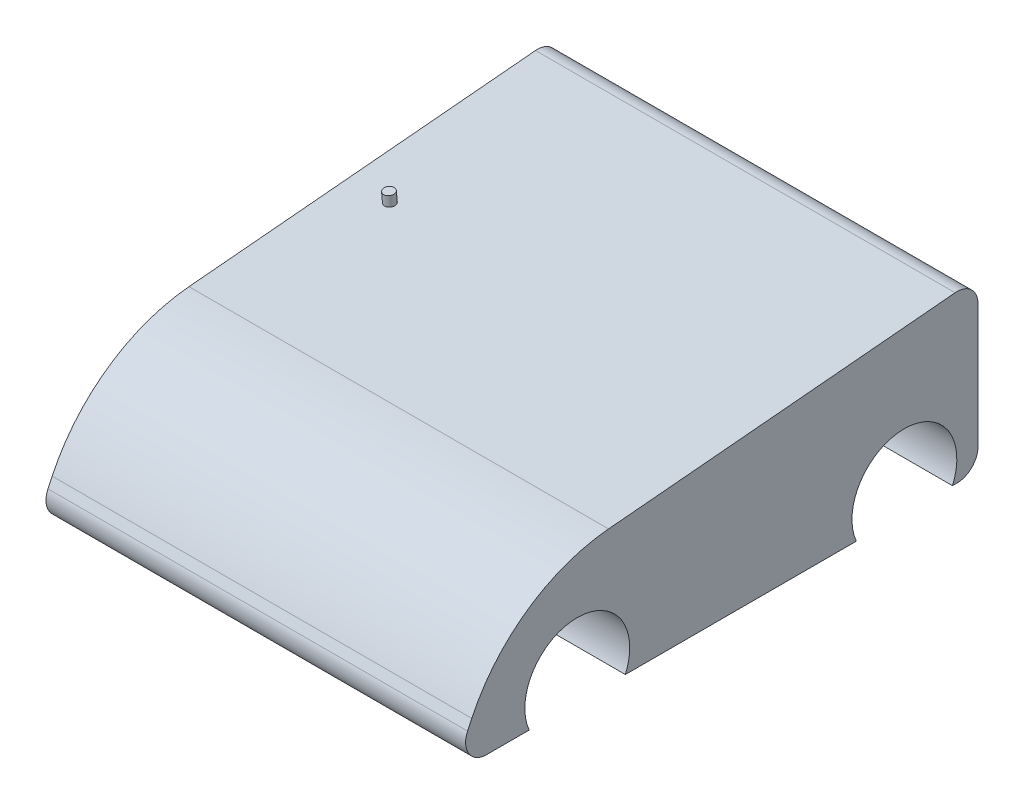
ISO-10303-21;
HEADER;
FILE_DESCRIPTION(('STEP AP214'),'2;1');
FILE_NAME('part.step','',(''),(''),'','','');
FILE_SCHEMA(('AUTOMOTIVE_DESIGN { 1 0 10303 214 1 1 1 1 }'));
ENDSEC;
DATA;
#1=APPLICATION_CONTEXT('core data for automotive mechanical design processes');
#2=APPLICATION_PROTOCOL_DEFINITION('international standard','automotive_design',2000,#1);
#3=PRODUCT_CONTEXT('',#1,'mechanical');
#4=PRODUCT('Part','Part','',(#3));
#5=PRODUCT_RELATED_PRODUCT_CATEGORY('part','',(#4));
#6=PRODUCT_DEFINITION_FORMATION('','',#4);
#7=PRODUCT_DEFINITION_CONTEXT('part definition',#1,'design');
#8=PRODUCT_DEFINITION('design','',#6,#7);
#9=PRODUCT_DEFINITION_SHAPE('','',#8);
#10=(LENGTH_UNIT() NAMED_UNIT(*) SI_UNIT(.MILLI.,.METRE.));
#11=(NAMED_UNIT(*) PLANE_ANGLE_UNIT() SI_UNIT($,.RADIAN.));
#12=(NAMED_UNIT(*) SI_UNIT($,.STERADIAN.) SOLID_ANGLE_UNIT());
#13=UNCERTAINTY_MEASURE_WITH_UNIT(LENGTH_MEASURE(1.E-05),#10,'distance_accuracy_value','');
#14=(GEOMETRIC_REPRESENTATION_CONTEXT(3) GLOBAL_UNCERTAINTY_ASSIGNED_CONTEXT((#13)) GLOBAL_UNIT_ASSIGNED_CONTEXT((#10,
#11,#12)) REPRESENTATION_CONTEXT('',''));
#15=CARTESIAN_POINT('',(0.,0.,0.));
#16=DIRECTION('',(0.,0.,1.));
#17=DIRECTION('',(1.,0.,0.));
#18=AXIS2_PLACEMENT_3D('',#15,#16,#17);
#19=CARTESIAN_POINT('',(100.,0.,-120.64681724846));
#20=DIRECTION('',(0.,1.,0.));
#21=DIRECTION('',(0.,0.,1.));
#22=AXIS2_PLACEMENT_3D('',#19,#20,#21);
#23=PLANE('',#22);
#24=DIRECTION('',(-1.,0.,0.));
#25=VECTOR('',#24,1.);
#26=CARTESIAN_POINT('',(-50.,0.,-118.474582971866));
#27=LINE('',#26,#25);
#28=CARTESIAN_POINT('',(-100.,0.,-118.474582971866));
#29=VERTEX_POINT('',#28);
#30=CARTESIAN_POINT('',(-50.,0.,-118.474582971866));
#31=VERTEX_POINT('',#30);
#32=EDGE_CURVE('E156',#29,#31,#27,.F.);
#33=ORIENTED_EDGE('',*,*,#32,.F.);
#34=DIRECTION('',(0.,0.,-1.));
#35=VECTOR('',#34,1.);
#36=CARTESIAN_POINT('',(-100.,0.,-120.64681724846));
#37=LINE('',#36,#35);
#38=CARTESIAN_POINT('',(-100.,0.,-120.64681724846));
#39=VERTEX_POINT('',#38);
#40=EDGE_CURVE('E219',#29,#39,#37,.T.);
#41=ORIENTED_EDGE('',*,*,#40,.T.);
#42=DIRECTION('',(-1.,0.,0.));
#43=VECTOR('',#42,1.);
#44=CARTESIAN_POINT('',(100.,0.,-120.64681724846));
#45=LINE('',#44,#43);
#46=CARTESIAN_POINT('',(100.,0.,-120.64681724846));
#47=VERTEX_POINT('',#46);
#48=EDGE_CURVE('E241',#47,#39,#45,.T.);
#49=ORIENTED_EDGE('',*,*,#48,.F.);
#50=DIRECTION('',(0.,0.,-1.));
#51=VECTOR('',#50,1.);
#52=CARTESIAN_POINT('',(100.,0.,-120.64681724846));
#53=LINE('',#52,#51);
#54=CARTESIAN_POINT('',(100.,0.,-118.474582971866));
#55=VERTEX_POINT('',#54);
#56=EDGE_CURVE('E199',#55,#47,#53,.T.);
#57=ORIENTED_EDGE('',*,*,#56,.F.);
#58=DIRECTION('',(1.,0.,0.));
#59=VECTOR('',#58,1.);
#60=CARTESIAN_POINT('',(50.,0.,-118.474582971866));
#61=LINE('',#60,#59);
#62=CARTESIAN_POINT('',(50.,0.,-118.474582971866));
#63=VERTEX_POINT('',#62);
#64=EDGE_CURVE('E175',#55,#63,#61,.F.);
#65=ORIENTED_EDGE('',*,*,#64,.T.);
#66=DIRECTION('',(0.,0.,-1.));
#67=VECTOR('',#66,1.);
#68=CARTESIAN_POINT('',(50.,0.,-120.64681724846));
#69=LINE('',#68,#67);
#70=CARTESIAN_POINT('',(50.,0.,-72.6488260223073));
#71=VERTEX_POINT('',#70);
#72=EDGE_CURVE('E261',#71,#63,#69,.T.);
#73=ORIENTED_EDGE('',*,*,#72,.F.);
#74=DIRECTION('',(1.,0.,0.));
#75=VECTOR('',#74,1.);
#76=CARTESIAN_POINT('',(50.,0.,-72.6488260223073));
#77=LINE('',#76,#75);
#78=CARTESIAN_POINT('',(100.,0.,-72.6488260223073));
#79=VERTEX_POINT('',#78);
#80=EDGE_CURVE('E178',#71,#79,#77,.T.);
#81=ORIENTED_EDGE('',*,*,#80,.T.);
#82=CARTESIAN_POINT('',(100.,0.,37.4446152953902));
#83=VERTEX_POINT('',#82);
#84=EDGE_CURVE('E204',#83,#79,#53,.T.);
#85=ORIENTED_EDGE('',*,*,#84,.F.);
#86=DIRECTION('',(1.,0.,0.));
#87=VECTOR('',#86,1.);
#88=CARTESIAN_POINT('',(50.,0.,37.4446152953902));
#89=LINE('',#88,#87);
#90=CARTESIAN_POINT('',(50.,0.,37.4446152953902));
#91=VERTEX_POINT('',#90);
#92=EDGE_CURVE('E184',#83,#91,#89,.F.);
#93=ORIENTED_EDGE('',*,*,#92,.T.);
#94=DIRECTION('',(0.,0.,-1.));
#95=VECTOR('',#94,1.);
#96=CARTESIAN_POINT('',(50.,0.,-120.64681724846));
#97=LINE('',#96,#95);
#98=CARTESIAN_POINT('',(50.,0.,83.2703722449486));
#99=VERTEX_POINT('',#98);
#100=EDGE_CURVE('E256',#99,#91,#97,.T.);
#101=ORIENTED_EDGE('',*,*,#100,.F.);
#102=DIRECTION('',(1.,0.,0.));
#103=VECTOR('',#102,1.);
#104=CARTESIAN_POINT('',(50.,0.,83.2703722449486));
#105=LINE('',#104,#103);
#106=CARTESIAN_POINT('',(100.,0.,83.2703722449486));
#107=VERTEX_POINT('',#106);
#108=EDGE_CURVE('E187',#99,#107,#105,.T.);
#109=ORIENTED_EDGE('',*,*,#108,.T.);
#110=CARTESIAN_POINT('',(100.,0.,103.595649646737));
#111=VERTEX_POINT('',#110);
#112=EDGE_CURVE('E200',#111,#107,#53,.T.);
#113=ORIENTED_EDGE('',*,*,#112,.F.);
#114=DIRECTION('',(-1.,0.,0.));
#115=VECTOR('',#114,1.);
#116=CARTESIAN_POINT('',(100.,0.,103.595649646737));
#117=LINE('',#116,#115);
#118=CARTESIAN_POINT('',(-100.,0.,103.595649646737));
#119=VERTEX_POINT('',#118);
#120=EDGE_CURVE('E244',#111,#119,#117,.T.);
#121=ORIENTED_EDGE('',*,*,#120,.T.);
#122=CARTESIAN_POINT('',(-100.,0.,83.2703722449486));
#123=VERTEX_POINT('',#122);
#124=EDGE_CURVE('E220',#119,#123,#37,.T.);
#125=ORIENTED_EDGE('',*,*,#124,.T.);
#126=DIRECTION('',(-1.,0.,0.));
#127=VECTOR('',#126,1.);
#128=CARTESIAN_POINT('',(-50.,0.,83.2703722449486));
#129=LINE('',#128,#127);
#130=CARTESIAN_POINT('',(-50.,0.,83.2703722449486));
#131=VERTEX_POINT('',#130);
#132=EDGE_CURVE('E58',#131,#123,#129,.T.);
#133=ORIENTED_EDGE('',*,*,#132,.F.);
#134=DIRECTION('',(0.,0.,1.));
#135=VECTOR('',#134,1.);
#136=CARTESIAN_POINT('',(-50.,0.,-120.64681724846));
#137=LINE('',#136,#135);
#138=CARTESIAN_POINT('',(-50.,0.,37.4446152953902));
#139=VERTEX_POINT('',#138);
#140=EDGE_CURVE('E265',#139,#131,#137,.T.);
#141=ORIENTED_EDGE('',*,*,#140,.F.);
#142=DIRECTION('',(-1.,0.,0.));
#143=VECTOR('',#142,1.);
#144=CARTESIAN_POINT('',(-50.,0.,37.4446152953902));
#145=LINE('',#144,#143);
#146=CARTESIAN_POINT('',(-100.,0.,37.4446152953902));
#147=VERTEX_POINT('',#146);
#148=EDGE_CURVE('E170',#147,#139,#145,.F.);
#149=ORIENTED_EDGE('',*,*,#148,.F.);
#150=CARTESIAN_POINT('',(-100.,0.,-72.6488260223073));
#151=VERTEX_POINT('',#150);
#152=EDGE_CURVE('E162',#147,#151,#37,.T.);
#153=ORIENTED_EDGE('',*,*,#152,.T.);
#154=DIRECTION('',(-1.,0.,0.));
#155=VECTOR('',#154,1.);
#156=CARTESIAN_POINT('',(-50.,0.,-72.6488260223073));
#157=LINE('',#156,#155);
#158=CARTESIAN_POINT('',(-50.,0.,-72.6488260223073));
#159=VERTEX_POINT('',#158);
#160=EDGE_CURVE('E50',#159,#151,#157,.T.);
#161=ORIENTED_EDGE('',*,*,#160,.F.);
#162=DIRECTION('',(0.,0.,1.));
#163=VECTOR('',#162,1.);
#164=CARTESIAN_POINT('',(-50.,0.,-120.64681724846));
#165=LINE('',#164,#163);
#166=EDGE_CURVE('E43',#31,#159,#165,.T.);
#167=ORIENTED_EDGE('',*,*,#166,.F.);
#168=EDGE_LOOP('',(#33,#41,#49,#57,#65,#73,#81,#85,#93,#101,#109,#113,#121,#125,#133,#141,#149,
#153,#161,#167));
#169=FACE_BOUND('',#168,.T.);
#170=ADVANCED_FACE('F35',(#169),#23,.F.);
#171=CARTESIAN_POINT('',(100.,-15.5574989256104,38.2592290091834));
#172=DIRECTION('',(-1.,0.,0.));
#173=DIRECTION('',(0.,0.,1.));
#174=AXIS2_PLACEMENT_3D('',#171,#172,#173);
#175=CYLINDRICAL_SURFACE('',#174,80.);
#176=CARTESIAN_POINT('',(-100.,-15.5574989256104,38.2592290091834));
#177=DIRECTION('',(1.,0.,0.));
#178=DIRECTION('',(0.,0.,1.));
#179=AXIS2_PLACEMENT_3D('',#176,#177,#178);
#180=CIRCLE('',#179,80.);
#181=CARTESIAN_POINT('',(-100.,64.1191375635172,45.4448812258877));
#182=VERTEX_POINT('',#181);
#183=CARTESIAN_POINT('',(-100.,18.5050709528454,110.645286598165));
#184=VERTEX_POINT('',#183);
#185=EDGE_CURVE('E190',#182,#184,#180,.T.);
#186=ORIENTED_EDGE('',*,*,#185,.T.);
#187=DIRECTION('',(-1.,0.,0.));
#188=VECTOR('',#187,1.);
#189=CARTESIAN_POINT('',(100.,18.5050709528454,110.645286598165));
#190=LINE('',#189,#188);
#191=CARTESIAN_POINT('',(100.,18.5050709528454,110.645286598165));
#192=VERTEX_POINT('',#191);
#193=EDGE_CURVE('E250',#192,#184,#190,.T.);
#194=ORIENTED_EDGE('',*,*,#193,.F.);
#195=CARTESIAN_POINT('',(100.,-15.5574989256104,38.2592290091834));
#196=DIRECTION('',(1.,0.,0.));
#197=DIRECTION('',(0.,0.,1.));
#198=AXIS2_PLACEMENT_3D('',#195,#196,#197);
#199=CIRCLE('',#198,80.);
#200=CARTESIAN_POINT('',(100.,64.1191375635172,45.4448812258877));
#201=VERTEX_POINT('',#200);
#202=EDGE_CURVE('E191',#201,#192,#199,.T.);
#203=ORIENTED_EDGE('',*,*,#202,.F.);
#204=DIRECTION('',(-1.,0.,0.));
#205=VECTOR('',#204,1.);
#206=CARTESIAN_POINT('',(100.,64.1191375635172,45.4448812258877));
#207=LINE('',#206,#205);
#208=EDGE_CURVE('E212',#201,#182,#207,.T.);
#209=ORIENTED_EDGE('',*,*,#208,.T.);
#210=EDGE_LOOP('',(#186,#194,#203,#209));
#211=FACE_BOUND('',#210,.T.);
#212=ADVANCED_FACE('F37',(#211),#175,.T.);
#213=CARTESIAN_POINT('',(100.,14.2578212348071,112.643906845359));
#214=DIRECTION('',(0.,-0.425782123480702,-0.904825719862264));
#215=DIRECTION('',(0.,0.904825719862264,-0.425782123480702));
#216=AXIS2_PLACEMENT_3D('',#213,#214,#215);
#217=PLANE('',#216);
#218=DIRECTION('',(0.,-0.904825719862264,0.425782123480702));
#219=VECTOR('',#218,1.);
#220=CARTESIAN_POINT('',(-100.,14.2578212348071,112.643906845359));
#221=LINE('',#220,#219);
#222=CARTESIAN_POINT('',(-100.,14.2578212348071,112.643906845359));
#223=VERTEX_POINT('',#222);
#224=EDGE_CURVE('E215',#184,#223,#221,.T.);
#225=ORIENTED_EDGE('',*,*,#224,.T.);
#226=DIRECTION('',(-1.,0.,0.));
#227=VECTOR('',#226,1.);
#228=CARTESIAN_POINT('',(100.,14.2578212348071,112.643906845359));
#229=LINE('',#228,#227);
#230=CARTESIAN_POINT('',(100.,14.2578212348071,112.643906845359));
#231=VERTEX_POINT('',#230);
#232=EDGE_CURVE('E247',#231,#223,#229,.T.);
#233=ORIENTED_EDGE('',*,*,#232,.F.);
#234=DIRECTION('',(0.,-0.904825719862264,0.425782123480702));
#235=VECTOR('',#234,1.);
#236=CARTESIAN_POINT('',(100.,14.2578212348071,112.643906845359));
#237=LINE('',#236,#235);
#238=EDGE_CURVE('E194',#192,#231,#237,.T.);
#239=ORIENTED_EDGE('',*,*,#238,.F.);
#240=ORIENTED_EDGE('',*,*,#193,.T.);
#241=EDGE_LOOP('',(#225,#233,#239,#240));
#242=FACE_BOUND('',#241,.T.);
#243=ADVANCED_FACE('F319',(#242),#217,.F.);
#244=CARTESIAN_POINT('',(100.,10.,103.595649646737));
#245=DIRECTION('',(-1.,0.,0.));
#246=DIRECTION('',(0.,0.,1.));
#247=AXIS2_PLACEMENT_3D('',#244,#245,#246);
#248=CYLINDRICAL_SURFACE('',#247,10.);
#249=CARTESIAN_POINT('',(-100.,10.,103.595649646737));
#250=DIRECTION('',(1.,0.,0.));
#251=DIRECTION('',(0.,0.,-1.));
#252=AXIS2_PLACEMENT_3D('',#249,#250,#251);
#253=CIRCLE('',#252,10.);
#254=EDGE_CURVE('E217',#223,#119,#253,.T.);
#255=ORIENTED_EDGE('',*,*,#254,.T.);
#256=ORIENTED_EDGE('',*,*,#120,.F.);
#257=CARTESIAN_POINT('',(100.,10.,103.595649646737));
#258=DIRECTION('',(1.,0.,0.));
#259=DIRECTION('',(0.,0.,-1.));
#260=AXIS2_PLACEMENT_3D('',#257,#258,#259);
#261=CIRCLE('',#260,10.);
#262=EDGE_CURVE('E197',#231,#111,#261,.T.);
#263=ORIENTED_EDGE('',*,*,#262,.F.);
#264=ORIENTED_EDGE('',*,*,#232,.T.);
#265=EDGE_LOOP('',(#255,#256,#263,#264));
#266=FACE_BOUND('',#265,.T.);
#267=ADVANCED_FACE('F324',(#266),#248,.T.);
#268=CARTESIAN_POINT('',(100.,10.,-120.64681724846));
#269=DIRECTION('',(-1.,0.,0.));
#270=DIRECTION('',(0.,0.,1.));
#271=AXIS2_PLACEMENT_3D('',#268,#269,#270);
#272=CYLINDRICAL_SURFACE('',#271,10.);
#273=CARTESIAN_POINT('',(-100.,10.,-120.64681724846));
#274=DIRECTION('',(1.,0.,0.));
#275=DIRECTION('',(0.,0.,1.));
#276=AXIS2_PLACEMENT_3D('',#273,#274,#275);
#277=CIRCLE('',#276,10.);
#278=CARTESIAN_POINT('',(-100.,10.0000000000001,-130.64681724846));
#279=VERTEX_POINT('',#278);
#280=EDGE_CURVE('E223',#39,#279,#277,.T.);
#281=ORIENTED_EDGE('',*,*,#280,.T.);
#282=DIRECTION('',(-1.,0.,0.));
#283=VECTOR('',#282,1.);
#284=CARTESIAN_POINT('',(100.,10.0000000000001,-130.64681724846));
#285=LINE('',#284,#283);
#286=CARTESIAN_POINT('',(100.,10.0000000000001,-130.64681724846));
#287=VERTEX_POINT('',#286);
#288=EDGE_CURVE('E238',#287,#279,#285,.T.);
#289=ORIENTED_EDGE('',*,*,#288,.F.);
#290=CARTESIAN_POINT('',(100.,10.,-120.64681724846));
#291=DIRECTION('',(1.,0.,0.));
#292=DIRECTION('',(0.,0.,1.));
#293=AXIS2_PLACEMENT_3D('',#290,#291,#292);
#294=CIRCLE('',#293,10.);
#295=EDGE_CURVE('E203',#47,#287,#294,.T.);
#296=ORIENTED_EDGE('',*,*,#295,.F.);
#297=ORIENTED_EDGE('',*,*,#48,.T.);
#298=EDGE_LOOP('',(#281,#289,#296,#297));
#299=FACE_BOUND('',#298,.T.);
#300=ADVANCED_FACE('F275',(#299),#272,.T.);
#301=CARTESIAN_POINT('',(100.,69.0575636650272,-130.64681724846));
#302=DIRECTION('',(0.,0.,1.));
#303=DIRECTION('',(1.,0.,0.));
#304=AXIS2_PLACEMENT_3D('',#301,#302,#303);
#305=PLANE('',#304);
#306=DIRECTION('',(0.,1.,0.));
#307=VECTOR('',#306,1.);
#308=CARTESIAN_POINT('',(-100.,69.0575636650272,-130.64681724846));
#309=LINE('',#308,#307);
#310=CARTESIAN_POINT('',(-100.,69.0575636650272,-130.64681724846));
#311=VERTEX_POINT('',#310);
#312=EDGE_CURVE('E225',#279,#311,#309,.T.);
#313=ORIENTED_EDGE('',*,*,#312,.T.);
#314=DIRECTION('',(-1.,0.,0.));
#315=VECTOR('',#314,1.);
#316=CARTESIAN_POINT('',(100.,69.0575636650272,-130.64681724846));
#317=LINE('',#316,#315);
#318=CARTESIAN_POINT('',(100.,69.0575636650272,-130.64681724846));
#319=VERTEX_POINT('',#318);
#320=EDGE_CURVE('E235',#319,#311,#317,.T.);
#321=ORIENTED_EDGE('',*,*,#320,.F.);
#322=DIRECTION('',(0.,1.,0.));
#323=VECTOR('',#322,1.);
#324=CARTESIAN_POINT('',(100.,69.0575636650272,-130.64681724846));
#325=LINE('',#324,#323);
#326=EDGE_CURVE('E206',#287,#319,#325,.T.);
#327=ORIENTED_EDGE('',*,*,#326,.F.);
#328=ORIENTED_EDGE('',*,*,#288,.T.);
#329=EDGE_LOOP('',(#313,#321,#327,#328));
#330=FACE_BOUND('',#329,.T.);
#331=ADVANCED_FACE('F282',(#330),#305,.F.);
#332=CARTESIAN_POINT('',(100.,69.0575636650273,-120.64681724846));
#333=DIRECTION('',(-1.,0.,0.));
#334=DIRECTION('',(0.,0.,1.));
#335=AXIS2_PLACEMENT_3D('',#332,#333,#334);
#336=CYLINDRICAL_SURFACE('',#335,10.);
#337=CARTESIAN_POINT('',(-100.,69.0575636650273,-120.64681724846));
#338=DIRECTION('',(1.,0.,0.));
#339=DIRECTION('',(0.,0.,1.));
#340=AXIS2_PLACEMENT_3D('',#337,#338,#339);
#341=CIRCLE('',#340,10.);
#342=CARTESIAN_POINT('',(-100.,79.0171432261682,-119.748610721372));
#343=VERTEX_POINT('',#342);
#344=EDGE_CURVE('E227',#311,#343,#341,.T.);
#345=ORIENTED_EDGE('',*,*,#344,.T.);
#346=DIRECTION('',(-1.,0.,0.));
#347=VECTOR('',#346,1.);
#348=CARTESIAN_POINT('',(100.,79.0171432261682,-119.748610721372));
#349=LINE('',#348,#347);
#350=CARTESIAN_POINT('',(100.,79.0171432261682,-119.748610721372));
#351=VERTEX_POINT('',#350);
#352=EDGE_CURVE('E232',#351,#343,#349,.T.);
#353=ORIENTED_EDGE('',*,*,#352,.F.);
#354=CARTESIAN_POINT('',(100.,69.0575636650273,-120.64681724846));
#355=DIRECTION('',(1.,0.,0.));
#356=DIRECTION('',(0.,0.,1.));
#357=AXIS2_PLACEMENT_3D('',#354,#355,#356);
#358=CIRCLE('',#357,10.);
#359=EDGE_CURVE('E208',#319,#351,#358,.T.);
#360=ORIENTED_EDGE('',*,*,#359,.F.);
#361=ORIENTED_EDGE('',*,*,#320,.T.);
#362=EDGE_LOOP('',(#345,#353,#360,#361));
#363=FACE_BOUND('',#362,.T.);
#364=ADVANCED_FACE('F286',(#363),#336,.T.);
#365=CARTESIAN_POINT('',(100.,64.1191375635172,45.4448812258877));
#366=DIRECTION('',(0.,-0.995957956114094,-0.0898206527088083));
#367=DIRECTION('',(0.,0.0898206527088083,-0.995957956114094));
#368=AXIS2_PLACEMENT_3D('',#365,#366,#367);
#369=PLANE('',#368);
#370=CARTESIAN_POINT('',(-80.,70.9523668704831,-30.3239858328722));
#371=DIRECTION('',(0.,-0.995957956114094,-0.0898206527088083));
#372=DIRECTION('',(0.,0.0898206527088083,-0.995957956114094));
#373=AXIS2_PLACEMENT_3D('',#370,#371,#372);
#374=CIRCLE('',#373,2.50000000000001);
#375=CARTESIAN_POINT('',(-80.,71.1769185022551,-32.8138807231575));
#376=VERTEX_POINT('',#375);
#377=EDGE_CURVE('E11',#376,#376,#374,.F.);
#378=ORIENTED_EDGE('',*,*,#377,.F.);
#379=EDGE_LOOP('',(#378));
#380=FACE_BOUND('',#379,.T.);
#381=DIRECTION('',(0.,-0.0898206527088083,0.995957956114094));
#382=VECTOR('',#381,1.);
#383=CARTESIAN_POINT('',(-100.,64.1191375635172,45.4448812258877));
#384=LINE('',#383,#382);
#385=EDGE_CURVE('E195',#343,#182,#384,.T.);
#386=ORIENTED_EDGE('',*,*,#385,.T.);
#387=ORIENTED_EDGE('',*,*,#208,.F.);
#388=DIRECTION('',(0.,-0.0898206527088083,0.995957956114094));
#389=VECTOR('',#388,1.);
#390=CARTESIAN_POINT('',(100.,64.1191375635172,45.4448812258877));
#391=LINE('',#390,#389);
#392=EDGE_CURVE('E210',#351,#201,#391,.T.);
#393=ORIENTED_EDGE('',*,*,#392,.F.);
#394=ORIENTED_EDGE('',*,*,#352,.T.);
#395=EDGE_LOOP('',(#386,#387,#393,#394));
#396=FACE_BOUND('',#395,.T.);
#397=ADVANCED_FACE('F342',(#380,#396),#369,.F.);
#398=CARTESIAN_POINT('',(100.,-15.5574989256104,38.2592290091834));
#399=DIRECTION('',(-1.,0.,0.));
#400=DIRECTION('',(0.,0.,1.));
#401=AXIS2_PLACEMENT_3D('',#398,#399,#400);
#402=PLANE('',#401);
#403=ORIENTED_EDGE('',*,*,#84,.T.);
#404=CARTESIAN_POINT('',(100.,10.,-95.5617044970865));
#405=DIRECTION('',(-1.,0.,0.));
#406=DIRECTION('',(0.,0.,1.));
#407=AXIS2_PLACEMENT_3D('',#404,#405,#406);
#408=CIRCLE('',#407,25.);
#409=EDGE_CURVE('E258',#79,#55,#408,.T.);
#410=ORIENTED_EDGE('',*,*,#409,.T.);
#411=ORIENTED_EDGE('',*,*,#56,.T.);
#412=ORIENTED_EDGE('',*,*,#295,.T.);
#413=ORIENTED_EDGE('',*,*,#326,.T.);
#414=ORIENTED_EDGE('',*,*,#359,.T.);
#415=ORIENTED_EDGE('',*,*,#392,.T.);
#416=ORIENTED_EDGE('',*,*,#202,.T.);
#417=ORIENTED_EDGE('',*,*,#238,.T.);
#418=ORIENTED_EDGE('',*,*,#262,.T.);
#419=ORIENTED_EDGE('',*,*,#112,.T.);
#420=CARTESIAN_POINT('',(100.,10.,60.3574937701694));
#421=DIRECTION('',(-1.,0.,0.));
#422=DIRECTION('',(0.,0.,1.));
#423=AXIS2_PLACEMENT_3D('',#420,#421,#422);
#424=CIRCLE('',#423,25.);
#425=EDGE_CURVE('E253',#107,#83,#424,.T.);
#426=ORIENTED_EDGE('',*,*,#425,.T.);
#427=EDGE_LOOP('',(#403,#410,#411,#412,#413,#414,#415,#416,#417,#418,#419,#426));
#428=FACE_BOUND('',#427,.T.);
#429=ADVANCED_FACE('F291',(#428),#402,.F.);
#430=CARTESIAN_POINT('',(-100.,-15.5574989256104,38.2592290091834));
#431=DIRECTION('',(-1.,0.,0.));
#432=DIRECTION('',(0.,0.,1.));
#433=AXIS2_PLACEMENT_3D('',#430,#431,#432);
#434=PLANE('',#433);
#435=ORIENTED_EDGE('',*,*,#40,.F.);
#436=CARTESIAN_POINT('',(-100.,10.,-95.5617044970865));
#437=DIRECTION('',(-1.,0.,0.));
#438=DIRECTION('',(0.,0.,1.));
#439=AXIS2_PLACEMENT_3D('',#436,#437,#438);
#440=CIRCLE('',#439,25.);
#441=EDGE_CURVE('E154',#29,#151,#440,.F.);
#442=ORIENTED_EDGE('',*,*,#441,.T.);
#443=ORIENTED_EDGE('',*,*,#152,.F.);
#444=CARTESIAN_POINT('',(-100.,10.,60.3574937701694));
#445=DIRECTION('',(-1.,0.,0.));
#446=DIRECTION('',(0.,0.,1.));
#447=AXIS2_PLACEMENT_3D('',#444,#445,#446);
#448=CIRCLE('',#447,25.);
#449=EDGE_CURVE('E263',#147,#123,#448,.F.);
#450=ORIENTED_EDGE('',*,*,#449,.T.);
#451=ORIENTED_EDGE('',*,*,#124,.F.);
#452=ORIENTED_EDGE('',*,*,#254,.F.);
#453=ORIENTED_EDGE('',*,*,#224,.F.);
#454=ORIENTED_EDGE('',*,*,#185,.F.);
#455=ORIENTED_EDGE('',*,*,#385,.F.);
#456=ORIENTED_EDGE('',*,*,#344,.F.);
#457=ORIENTED_EDGE('',*,*,#312,.F.);
#458=ORIENTED_EDGE('',*,*,#280,.F.);
#459=EDGE_LOOP('',(#435,#442,#443,#450,#451,#452,#453,#454,#455,#456,#457,#458));
#460=FACE_BOUND('',#459,.T.);
#461=ADVANCED_FACE('F269',(#460),#434,.T.);
#462=CARTESIAN_POINT('',(50.,10.,60.3574937701694));
#463=DIRECTION('',(1.,0.,0.));
#464=DIRECTION('',(0.,0.,-1.));
#465=AXIS2_PLACEMENT_3D('',#462,#463,#464);
#466=PLANE('',#465);
#467=ORIENTED_EDGE('',*,*,#100,.T.);
#468=CARTESIAN_POINT('',(50.,10.,60.3574937701694));
#469=DIRECTION('',(1.,0.,0.));
#470=DIRECTION('',(0.,0.,-1.));
#471=AXIS2_PLACEMENT_3D('',#468,#469,#470);
#472=CIRCLE('',#471,25.);
#473=EDGE_CURVE('E181',#91,#99,#472,.T.);
#474=ORIENTED_EDGE('',*,*,#473,.T.);
#475=EDGE_LOOP('',(#467,#474));
#476=FACE_BOUND('',#475,.T.);
#477=ADVANCED_FACE('F310',(#476),#466,.T.);
#478=CARTESIAN_POINT('',(50.,10.,60.3574937701694));
#479=DIRECTION('',(1.,0.,0.));
#480=DIRECTION('',(0.,0.,-1.));
#481=AXIS2_PLACEMENT_3D('',#478,#479,#480);
#482=CYLINDRICAL_SURFACE('',#481,25.);
#483=ORIENTED_EDGE('',*,*,#473,.F.);
#484=ORIENTED_EDGE('',*,*,#92,.F.);
#485=ORIENTED_EDGE('',*,*,#425,.F.);
#486=ORIENTED_EDGE('',*,*,#108,.F.);
#487=EDGE_LOOP('',(#483,#484,#485,#486));
#488=FACE_BOUND('',#487,.T.);
#489=ADVANCED_FACE('F302',(#488),#482,.F.);
#490=CARTESIAN_POINT('',(50.,10.,-95.5617044970865));
#491=DIRECTION('',(1.,0.,0.));
#492=DIRECTION('',(0.,0.,-1.));
#493=AXIS2_PLACEMENT_3D('',#490,#491,#492);
#494=PLANE('',#493);
#495=ORIENTED_EDGE('',*,*,#72,.T.);
#496=CARTESIAN_POINT('',(50.,10.,-95.5617044970865));
#497=DIRECTION('',(1.,0.,0.));
#498=DIRECTION('',(0.,0.,-1.));
#499=AXIS2_PLACEMENT_3D('',#496,#497,#498);
#500=CIRCLE('',#499,25.);
#501=EDGE_CURVE('E172',#63,#71,#500,.T.);
#502=ORIENTED_EDGE('',*,*,#501,.T.);
#503=EDGE_LOOP('',(#495,#502));
#504=FACE_BOUND('',#503,.T.);
#505=ADVANCED_FACE('F300',(#504),#494,.T.);
#506=CARTESIAN_POINT('',(50.,10.,-95.5617044970865));
#507=DIRECTION('',(1.,0.,0.));
#508=DIRECTION('',(0.,0.,-1.));
#509=AXIS2_PLACEMENT_3D('',#506,#507,#508);
#510=CYLINDRICAL_SURFACE('',#509,25.);
#511=ORIENTED_EDGE('',*,*,#501,.F.);
#512=ORIENTED_EDGE('',*,*,#64,.F.);
#513=ORIENTED_EDGE('',*,*,#409,.F.);
#514=ORIENTED_EDGE('',*,*,#80,.F.);
#515=EDGE_LOOP('',(#511,#512,#513,#514));
#516=FACE_BOUND('',#515,.T.);
#517=ADVANCED_FACE('F298',(#516),#510,.F.);
#518=CARTESIAN_POINT('',(-50.,10.,60.3574937701694));
#519=DIRECTION('',(-1.,0.,0.));
#520=DIRECTION('',(0.,0.,-1.));
#521=AXIS2_PLACEMENT_3D('',#518,#519,#520);
#522=PLANE('',#521);
#523=ORIENTED_EDGE('',*,*,#140,.T.);
#524=CARTESIAN_POINT('',(-50.,10.,60.3574937701694));
#525=DIRECTION('',(1.,0.,0.));
#526=DIRECTION('',(0.,0.,-1.));
#527=AXIS2_PLACEMENT_3D('',#524,#525,#526);
#528=CIRCLE('',#527,25.);
#529=EDGE_CURVE('E164',#139,#131,#528,.T.);
#530=ORIENTED_EDGE('',*,*,#529,.F.);
#531=EDGE_LOOP('',(#523,#530));
#532=FACE_BOUND('',#531,.T.);
#533=ADVANCED_FACE('F308',(#532),#522,.T.);
#534=CARTESIAN_POINT('',(-50.,10.,60.3574937701694));
#535=DIRECTION('',(-1.,0.,0.));
#536=DIRECTION('',(0.,0.,1.));
#537=AXIS2_PLACEMENT_3D('',#534,#535,#536);
#538=CYLINDRICAL_SURFACE('',#537,25.);
#539=ORIENTED_EDGE('',*,*,#148,.T.);
#540=ORIENTED_EDGE('',*,*,#529,.T.);
#541=ORIENTED_EDGE('',*,*,#132,.T.);
#542=ORIENTED_EDGE('',*,*,#449,.F.);
#543=EDGE_LOOP('',(#539,#540,#541,#542));
#544=FACE_BOUND('',#543,.T.);
#545=ADVANCED_FACE('F419',(#544),#538,.F.);
#546=CARTESIAN_POINT('',(-50.,10.,-95.5617044970865));
#547=DIRECTION('',(-1.,0.,0.));
#548=DIRECTION('',(0.,0.,-1.));
#549=AXIS2_PLACEMENT_3D('',#546,#547,#548);
#550=PLANE('',#549);
#551=ORIENTED_EDGE('',*,*,#166,.T.);
#552=CARTESIAN_POINT('',(-50.,10.,-95.5617044970865));
#553=DIRECTION('',(1.,0.,0.));
#554=DIRECTION('',(0.,0.,-1.));
#555=AXIS2_PLACEMENT_3D('',#552,#553,#554);
#556=CIRCLE('',#555,25.);
#557=EDGE_CURVE('E151',#31,#159,#556,.T.);
#558=ORIENTED_EDGE('',*,*,#557,.F.);
#559=EDGE_LOOP('',(#551,#558));
#560=FACE_BOUND('',#559,.T.);
#561=ADVANCED_FACE('F150',(#560),#550,.T.);
#562=CARTESIAN_POINT('',(-50.,10.,-95.5617044970865));
#563=DIRECTION('',(-1.,0.,0.));
#564=DIRECTION('',(0.,0.,1.));
#565=AXIS2_PLACEMENT_3D('',#562,#563,#564);
#566=CYLINDRICAL_SURFACE('',#565,25.);
#567=ORIENTED_EDGE('',*,*,#32,.T.);
#568=ORIENTED_EDGE('',*,*,#557,.T.);
#569=ORIENTED_EDGE('',*,*,#160,.T.);
#570=ORIENTED_EDGE('',*,*,#441,.F.);
#571=EDGE_LOOP('',(#567,#568,#569,#570));
#572=FACE_BOUND('',#571,.T.);
#573=ADVANCED_FACE('F155',(#572),#566,.F.);
#574=CARTESIAN_POINT('',(-80.,75.9321566510536,-29.8748825693282));
#575=DIRECTION('',(0.,-0.995957956114094,-0.0898206527088083));
#576=DIRECTION('',(0.,0.0898206527088083,-0.995957956114094));
#577=AXIS2_PLACEMENT_3D('',#574,#575,#576);
#578=CYLINDRICAL_SURFACE('',#577,2.50000000000001);
#579=CARTESIAN_POINT('',(-80.,75.9321566510536,-29.8748825693282));
#580=DIRECTION('',(0.,0.995957956114094,0.0898206527088083));
#581=DIRECTION('',(0.,-0.0898206527088083,0.995957956114094));
#582=AXIS2_PLACEMENT_3D('',#579,#580,#581);
#583=CIRCLE('',#582,2.50000000000001);
#584=CARTESIAN_POINT('',(-80.,75.7076050192816,-27.3849876790429));
#585=VERTEX_POINT('',#584);
#586=EDGE_CURVE('E157',#585,#585,#583,.T.);
#587=ORIENTED_EDGE('',*,*,#586,.F.);
#588=EDGE_LOOP('',(#587));
#589=FACE_BOUND('',#588,.T.);
#590=ORIENTED_EDGE('',*,*,#377,.T.);
#591=EDGE_LOOP('',(#590));
#592=FACE_BOUND('',#591,.T.);
#593=ADVANCED_FACE('F445',(#589,#592),#578,.T.);
#594=CARTESIAN_POINT('',(-80.,75.9321566510536,-29.8748825693282));
#595=DIRECTION('',(0.,0.995957956114094,0.0898206527088083));
#596=DIRECTION('',(0.,-0.0898206527088083,0.995957956114094));
#597=AXIS2_PLACEMENT_3D('',#594,#595,#596);
#598=PLANE('',#597);
#599=ORIENTED_EDGE('',*,*,#586,.T.);
#600=EDGE_LOOP('',(#599));
#601=FACE_BOUND('',#600,.T.);
#602=ADVANCED_FACE('F462',(#601),#598,.T.);
#603=CLOSED_SHELL('',(#170,#212,#243,#267,#300,#331,#364,#397,#429,#461,#477,#489,#505,#517,
#533,#545,#561,#573,#593,#602));
#604=MANIFOLD_SOLID_BREP('B2',#603);
#605=ADVANCED_BREP_SHAPE_REPRESENTATION('',(#18,#604),#14);
#606=SHAPE_DEFINITION_REPRESENTATION(#9,#605);
ENDSEC;
END-ISO-10303-21;
